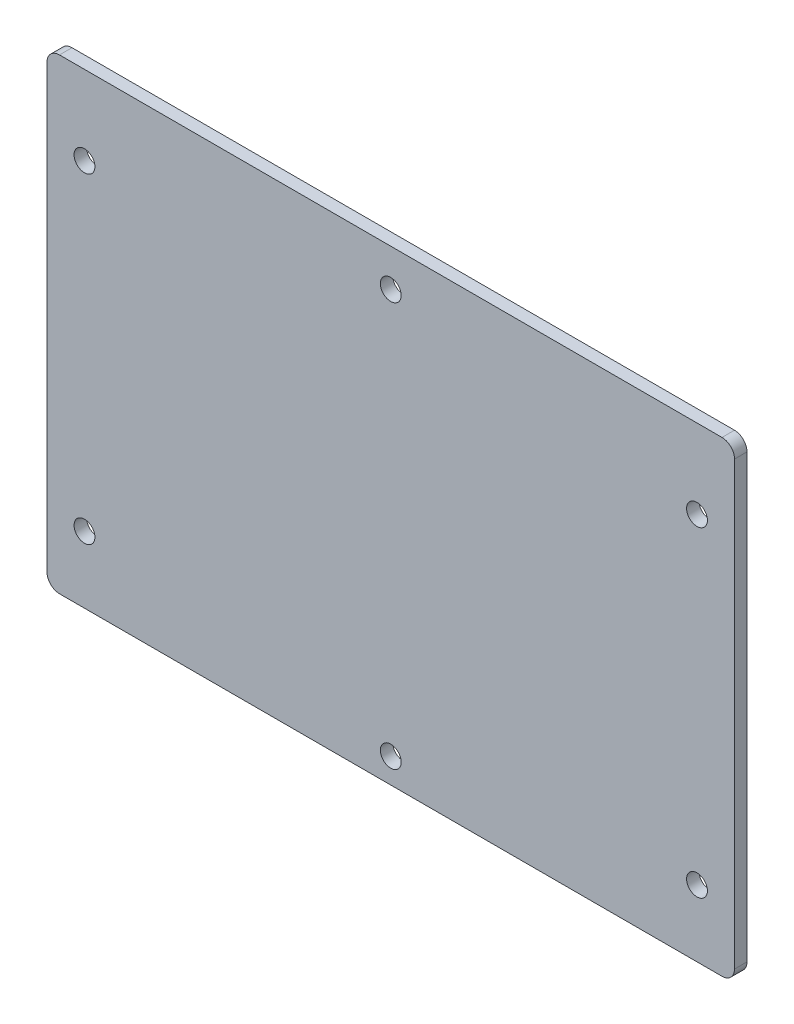
ISO-10303-21;
HEADER;
FILE_DESCRIPTION(('STEP AP214'),'2;1');
FILE_NAME('part.step','',(''),(''),'','','');
FILE_SCHEMA(('AUTOMOTIVE_DESIGN { 1 0 10303 214 1 1 1 1 }'));
ENDSEC;
DATA;
#1=APPLICATION_CONTEXT('core data for automotive mechanical design processes');
#2=APPLICATION_PROTOCOL_DEFINITION('international standard','automotive_design',2000,#1);
#3=PRODUCT_CONTEXT('',#1,'mechanical');
#4=PRODUCT('Part','Part','',(#3));
#5=PRODUCT_RELATED_PRODUCT_CATEGORY('part','',(#4));
#6=PRODUCT_DEFINITION_FORMATION('','',#4);
#7=PRODUCT_DEFINITION_CONTEXT('part definition',#1,'design');
#8=PRODUCT_DEFINITION('design','',#6,#7);
#9=PRODUCT_DEFINITION_SHAPE('','',#8);
#10=(LENGTH_UNIT() NAMED_UNIT(*) SI_UNIT(.MILLI.,.METRE.));
#11=(NAMED_UNIT(*) PLANE_ANGLE_UNIT() SI_UNIT($,.RADIAN.));
#12=(NAMED_UNIT(*) SI_UNIT($,.STERADIAN.) SOLID_ANGLE_UNIT());
#13=UNCERTAINTY_MEASURE_WITH_UNIT(LENGTH_MEASURE(1.E-05),#10,'distance_accuracy_value','');
#14=(GEOMETRIC_REPRESENTATION_CONTEXT(3) GLOBAL_UNCERTAINTY_ASSIGNED_CONTEXT((#13)) GLOBAL_UNIT_ASSIGNED_CONTEXT((#10,
#11,#12)) REPRESENTATION_CONTEXT('',''));
#15=CARTESIAN_POINT('',(0.,0.,0.));
#16=DIRECTION('',(0.,0.,1.));
#17=DIRECTION('',(1.,0.,0.));
#18=AXIS2_PLACEMENT_3D('',#15,#16,#17);
#19=CARTESIAN_POINT('',(0.,0.,3.));
#20=DIRECTION('',(0.,0.,-1.));
#21=DIRECTION('',(-1.,0.,0.));
#22=AXIS2_PLACEMENT_3D('',#19,#20,#21);
#23=PLANE('',#22);
#24=DIRECTION('',(0.,-1.,0.));
#25=VECTOR('',#24,1.);
#26=CARTESIAN_POINT('',(0.,0.,3.));
#27=LINE('',#26,#25);
#28=CARTESIAN_POINT('',(0.,115.00212,3.));
#29=VERTEX_POINT('',#28);
#30=CARTESIAN_POINT('',(0.,8.99999999999999,3.));
#31=VERTEX_POINT('',#30);
#32=EDGE_CURVE('E125',#29,#31,#27,.T.);
#33=ORIENTED_EDGE('',*,*,#32,.T.);
#34=CARTESIAN_POINT('',(3.,8.99999999999999,3.));
#35=DIRECTION('',(0.,0.,-1.));
#36=DIRECTION('',(-1.,0.,0.));
#37=AXIS2_PLACEMENT_3D('',#34,#35,#36);
#38=CIRCLE('',#37,3.);
#39=CARTESIAN_POINT('',(3.,5.99999999999999,3.));
#40=VERTEX_POINT('',#39);
#41=EDGE_CURVE('E41',#31,#40,#38,.F.);
#42=ORIENTED_EDGE('',*,*,#41,.T.);
#43=DIRECTION('',(1.,0.,0.));
#44=VECTOR('',#43,1.);
#45=CARTESIAN_POINT('',(0.,5.99999999999999,3.));
#46=LINE('',#45,#44);
#47=CARTESIAN_POINT('',(162.,5.99999999999999,3.));
#48=VERTEX_POINT('',#47);
#49=EDGE_CURVE('E157',#40,#48,#46,.T.);
#50=ORIENTED_EDGE('',*,*,#49,.T.);
#51=CARTESIAN_POINT('',(162.,8.99999999999999,3.));
#52=DIRECTION('',(0.,0.,-1.));
#53=DIRECTION('',(-1.,0.,0.));
#54=AXIS2_PLACEMENT_3D('',#51,#52,#53);
#55=CIRCLE('',#54,3.);
#56=CARTESIAN_POINT('',(165.,8.99999999999999,3.));
#57=VERTEX_POINT('',#56);
#58=EDGE_CURVE('E48',#48,#57,#55,.F.);
#59=ORIENTED_EDGE('',*,*,#58,.T.);
#60=DIRECTION('',(0.,1.,0.));
#61=VECTOR('',#60,1.);
#62=CARTESIAN_POINT('',(165.,118.00212,3.));
#63=LINE('',#62,#61);
#64=CARTESIAN_POINT('',(165.,115.00212,3.));
#65=VERTEX_POINT('',#64);
#66=EDGE_CURVE('E171',#57,#65,#63,.T.);
#67=ORIENTED_EDGE('',*,*,#66,.T.);
#68=CARTESIAN_POINT('',(162.,115.00212,3.));
#69=DIRECTION('',(0.,0.,-1.));
#70=DIRECTION('',(-1.,0.,0.));
#71=AXIS2_PLACEMENT_3D('',#68,#69,#70);
#72=CIRCLE('',#71,3.);
#73=CARTESIAN_POINT('',(162.,118.00212,3.));
#74=VERTEX_POINT('',#73);
#75=EDGE_CURVE('E124',#65,#74,#72,.F.);
#76=ORIENTED_EDGE('',*,*,#75,.T.);
#77=DIRECTION('',(-1.,0.,0.));
#78=VECTOR('',#77,1.);
#79=CARTESIAN_POINT('',(0.,118.00212,3.));
#80=LINE('',#79,#78);
#81=CARTESIAN_POINT('',(3.,118.00212,3.));
#82=VERTEX_POINT('',#81);
#83=EDGE_CURVE('E127',#74,#82,#80,.T.);
#84=ORIENTED_EDGE('',*,*,#83,.T.);
#85=CARTESIAN_POINT('',(3.,115.00212,3.));
#86=DIRECTION('',(0.,0.,-1.));
#87=DIRECTION('',(-1.,0.,0.));
#88=AXIS2_PLACEMENT_3D('',#85,#86,#87);
#89=CIRCLE('',#88,3.);
#90=EDGE_CURVE('E135',#82,#29,#89,.F.);
#91=ORIENTED_EDGE('',*,*,#90,.T.);
#92=EDGE_LOOP('',(#33,#42,#50,#59,#67,#76,#84,#91));
#93=FACE_BOUND('',#92,.T.);
#94=CARTESIAN_POINT('',(82.5,109.00212,3.));
#95=DIRECTION('',(0.,0.,1.));
#96=DIRECTION('',(1.,0.,0.));
#97=AXIS2_PLACEMENT_3D('',#94,#95,#96);
#98=CIRCLE('',#97,2.50000000000001);
#99=CARTESIAN_POINT('',(85.,109.00212,3.));
#100=VERTEX_POINT('',#99);
#101=EDGE_CURVE('E110',#100,#100,#98,.T.);
#102=ORIENTED_EDGE('',*,*,#101,.F.);
#103=EDGE_LOOP('',(#102));
#104=FACE_BOUND('',#103,.T.);
#105=CARTESIAN_POINT('',(9.00000000000001,99.00212,3.));
#106=DIRECTION('',(0.,0.,1.));
#107=DIRECTION('',(1.,0.,0.));
#108=AXIS2_PLACEMENT_3D('',#105,#106,#107);
#109=CIRCLE('',#108,2.50000000000002);
#110=CARTESIAN_POINT('',(11.5,99.00212,3.));
#111=VERTEX_POINT('',#110);
#112=EDGE_CURVE('E181',#111,#111,#109,.T.);
#113=ORIENTED_EDGE('',*,*,#112,.F.);
#114=EDGE_LOOP('',(#113));
#115=FACE_BOUND('',#114,.T.);
#116=CARTESIAN_POINT('',(9.00000000000001,22.,3.));
#117=DIRECTION('',(0.,0.,1.));
#118=DIRECTION('',(-1.,0.,0.));
#119=AXIS2_PLACEMENT_3D('',#116,#117,#118);
#120=CIRCLE('',#119,2.50000000000002);
#121=CARTESIAN_POINT('',(6.49999999999999,22.,3.));
#122=VERTEX_POINT('',#121);
#123=EDGE_CURVE('E187',#122,#122,#120,.T.);
#124=ORIENTED_EDGE('',*,*,#123,.F.);
#125=EDGE_LOOP('',(#124));
#126=FACE_BOUND('',#125,.T.);
#127=CARTESIAN_POINT('',(82.5,12.,3.));
#128=DIRECTION('',(0.,0.,1.));
#129=DIRECTION('',(-1.,0.,0.));
#130=AXIS2_PLACEMENT_3D('',#127,#128,#129);
#131=CIRCLE('',#130,2.50000000000001);
#132=CARTESIAN_POINT('',(80.,12.,3.));
#133=VERTEX_POINT('',#132);
#134=EDGE_CURVE('E193',#133,#133,#131,.T.);
#135=ORIENTED_EDGE('',*,*,#134,.F.);
#136=EDGE_LOOP('',(#135));
#137=FACE_BOUND('',#136,.T.);
#138=CARTESIAN_POINT('',(156.,99.00212,3.));
#139=DIRECTION('',(0.,0.,1.));
#140=DIRECTION('',(-1.,0.,0.));
#141=AXIS2_PLACEMENT_3D('',#138,#139,#140);
#142=CIRCLE('',#141,2.50000000000002);
#143=CARTESIAN_POINT('',(153.5,99.00212,3.));
#144=VERTEX_POINT('',#143);
#145=EDGE_CURVE('E199',#144,#144,#142,.T.);
#146=ORIENTED_EDGE('',*,*,#145,.F.);
#147=EDGE_LOOP('',(#146));
#148=FACE_BOUND('',#147,.T.);
#149=CARTESIAN_POINT('',(156.,22.,3.));
#150=DIRECTION('',(0.,0.,1.));
#151=DIRECTION('',(1.,0.,0.));
#152=AXIS2_PLACEMENT_3D('',#149,#150,#151);
#153=CIRCLE('',#152,2.50000000000002);
#154=CARTESIAN_POINT('',(158.5,22.,3.));
#155=VERTEX_POINT('',#154);
#156=EDGE_CURVE('E205',#155,#155,#153,.T.);
#157=ORIENTED_EDGE('',*,*,#156,.F.);
#158=EDGE_LOOP('',(#157));
#159=FACE_BOUND('',#158,.T.);
#160=ADVANCED_FACE('F33',(#93,#104,#115,#126,#137,#148,#159),#23,.F.);
#161=CARTESIAN_POINT('',(0.,0.,0.));
#162=DIRECTION('',(0.,0.,-1.));
#163=DIRECTION('',(-1.,0.,0.));
#164=AXIS2_PLACEMENT_3D('',#161,#162,#163);
#165=PLANE('',#164);
#166=DIRECTION('',(1.,0.,0.));
#167=VECTOR('',#166,1.);
#168=CARTESIAN_POINT('',(0.,5.99999999999999,0.));
#169=LINE('',#168,#167);
#170=CARTESIAN_POINT('',(3.,5.99999999999999,0.));
#171=VERTEX_POINT('',#170);
#172=CARTESIAN_POINT('',(162.,5.99999999999999,0.));
#173=VERTEX_POINT('',#172);
#174=EDGE_CURVE('E165',#171,#173,#169,.T.);
#175=ORIENTED_EDGE('',*,*,#174,.F.);
#176=CARTESIAN_POINT('',(3.,8.99999999999999,0.));
#177=DIRECTION('',(0.,0.,-1.));
#178=DIRECTION('',(-1.,0.,0.));
#179=AXIS2_PLACEMENT_3D('',#176,#177,#178);
#180=CIRCLE('',#179,3.);
#181=CARTESIAN_POINT('',(0.,8.99999999999999,0.));
#182=VERTEX_POINT('',#181);
#183=EDGE_CURVE('E151',#171,#182,#180,.T.);
#184=ORIENTED_EDGE('',*,*,#183,.T.);
#185=DIRECTION('',(0.,-1.,0.));
#186=VECTOR('',#185,1.);
#187=CARTESIAN_POINT('',(0.,0.,0.));
#188=LINE('',#187,#186);
#189=CARTESIAN_POINT('',(0.,115.00212,0.));
#190=VERTEX_POINT('',#189);
#191=EDGE_CURVE('E130',#190,#182,#188,.T.);
#192=ORIENTED_EDGE('',*,*,#191,.F.);
#193=CARTESIAN_POINT('',(3.,115.00212,0.));
#194=DIRECTION('',(0.,0.,-1.));
#195=DIRECTION('',(-1.,0.,0.));
#196=AXIS2_PLACEMENT_3D('',#193,#194,#195);
#197=CIRCLE('',#196,3.);
#198=CARTESIAN_POINT('',(3.,118.00212,0.));
#199=VERTEX_POINT('',#198);
#200=EDGE_CURVE('E121',#190,#199,#197,.T.);
#201=ORIENTED_EDGE('',*,*,#200,.T.);
#202=DIRECTION('',(-1.,0.,0.));
#203=VECTOR('',#202,1.);
#204=CARTESIAN_POINT('',(0.,118.00212,0.));
#205=LINE('',#204,#203);
#206=CARTESIAN_POINT('',(162.,118.00212,0.));
#207=VERTEX_POINT('',#206);
#208=EDGE_CURVE('E109',#207,#199,#205,.T.);
#209=ORIENTED_EDGE('',*,*,#208,.F.);
#210=CARTESIAN_POINT('',(162.,115.00212,0.));
#211=DIRECTION('',(0.,0.,-1.));
#212=DIRECTION('',(-1.,0.,0.));
#213=AXIS2_PLACEMENT_3D('',#210,#211,#212);
#214=CIRCLE('',#213,3.);
#215=CARTESIAN_POINT('',(165.,115.00212,0.));
#216=VERTEX_POINT('',#215);
#217=EDGE_CURVE('E113',#207,#216,#214,.T.);
#218=ORIENTED_EDGE('',*,*,#217,.T.);
#219=DIRECTION('',(0.,1.,0.));
#220=VECTOR('',#219,1.);
#221=CARTESIAN_POINT('',(165.,118.00212,0.));
#222=LINE('',#221,#220);
#223=CARTESIAN_POINT('',(165.,8.99999999999999,0.));
#224=VERTEX_POINT('',#223);
#225=EDGE_CURVE('E101',#224,#216,#222,.T.);
#226=ORIENTED_EDGE('',*,*,#225,.F.);
#227=CARTESIAN_POINT('',(162.,8.99999999999999,0.));
#228=DIRECTION('',(0.,0.,-1.));
#229=DIRECTION('',(-1.,0.,0.));
#230=AXIS2_PLACEMENT_3D('',#227,#228,#229);
#231=CIRCLE('',#230,3.);
#232=EDGE_CURVE('E149',#224,#173,#231,.T.);
#233=ORIENTED_EDGE('',*,*,#232,.T.);
#234=EDGE_LOOP('',(#175,#184,#192,#201,#209,#218,#226,#233));
#235=FACE_BOUND('',#234,.T.);
#236=CARTESIAN_POINT('',(156.,99.00212,0.));
#237=DIRECTION('',(0.,0.,1.));
#238=DIRECTION('',(-1.,0.,0.));
#239=AXIS2_PLACEMENT_3D('',#236,#237,#238);
#240=CIRCLE('',#239,2.50000000000002);
#241=CARTESIAN_POINT('',(153.5,99.00212,0.));
#242=VERTEX_POINT('',#241);
#243=EDGE_CURVE('E202',#242,#242,#240,.T.);
#244=ORIENTED_EDGE('',*,*,#243,.T.);
#245=EDGE_LOOP('',(#244));
#246=FACE_BOUND('',#245,.T.);
#247=CARTESIAN_POINT('',(9.00000000000001,22.,0.));
#248=DIRECTION('',(0.,0.,1.));
#249=DIRECTION('',(-1.,0.,0.));
#250=AXIS2_PLACEMENT_3D('',#247,#248,#249);
#251=CIRCLE('',#250,2.50000000000002);
#252=CARTESIAN_POINT('',(6.49999999999999,22.,0.));
#253=VERTEX_POINT('',#252);
#254=EDGE_CURVE('E190',#253,#253,#251,.T.);
#255=ORIENTED_EDGE('',*,*,#254,.T.);
#256=EDGE_LOOP('',(#255));
#257=FACE_BOUND('',#256,.T.);
#258=CARTESIAN_POINT('',(82.5,109.00212,0.));
#259=DIRECTION('',(0.,0.,1.));
#260=DIRECTION('',(1.,0.,0.));
#261=AXIS2_PLACEMENT_3D('',#258,#259,#260);
#262=CIRCLE('',#261,2.50000000000001);
#263=CARTESIAN_POINT('',(85.,109.00212,0.));
#264=VERTEX_POINT('',#263);
#265=EDGE_CURVE('E178',#264,#264,#262,.T.);
#266=ORIENTED_EDGE('',*,*,#265,.T.);
#267=EDGE_LOOP('',(#266));
#268=FACE_BOUND('',#267,.T.);
#269=CARTESIAN_POINT('',(9.00000000000001,99.00212,0.));
#270=DIRECTION('',(0.,0.,1.));
#271=DIRECTION('',(1.,0.,0.));
#272=AXIS2_PLACEMENT_3D('',#269,#270,#271);
#273=CIRCLE('',#272,2.50000000000002);
#274=CARTESIAN_POINT('',(11.5,99.00212,0.));
#275=VERTEX_POINT('',#274);
#276=EDGE_CURVE('E184',#275,#275,#273,.T.);
#277=ORIENTED_EDGE('',*,*,#276,.T.);
#278=EDGE_LOOP('',(#277));
#279=FACE_BOUND('',#278,.T.);
#280=CARTESIAN_POINT('',(82.5,12.,0.));
#281=DIRECTION('',(0.,0.,1.));
#282=DIRECTION('',(-1.,0.,0.));
#283=AXIS2_PLACEMENT_3D('',#280,#281,#282);
#284=CIRCLE('',#283,2.50000000000001);
#285=CARTESIAN_POINT('',(80.,12.,0.));
#286=VERTEX_POINT('',#285);
#287=EDGE_CURVE('E196',#286,#286,#284,.T.);
#288=ORIENTED_EDGE('',*,*,#287,.T.);
#289=EDGE_LOOP('',(#288));
#290=FACE_BOUND('',#289,.T.);
#291=CARTESIAN_POINT('',(156.,22.,0.));
#292=DIRECTION('',(0.,0.,1.));
#293=DIRECTION('',(1.,0.,0.));
#294=AXIS2_PLACEMENT_3D('',#291,#292,#293);
#295=CIRCLE('',#294,2.50000000000002);
#296=CARTESIAN_POINT('',(158.5,22.,0.));
#297=VERTEX_POINT('',#296);
#298=EDGE_CURVE('E164',#297,#297,#295,.T.);
#299=ORIENTED_EDGE('',*,*,#298,.T.);
#300=EDGE_LOOP('',(#299));
#301=FACE_BOUND('',#300,.T.);
#302=ADVANCED_FACE('F115',(#235,#246,#257,#268,#279,#290,#301),#165,.T.);
#303=CARTESIAN_POINT('',(165.,118.00212,3.));
#304=DIRECTION('',(-1.,0.,0.));
#305=DIRECTION('',(0.,0.,1.));
#306=AXIS2_PLACEMENT_3D('',#303,#304,#305);
#307=PLANE('',#306);
#308=ORIENTED_EDGE('',*,*,#66,.F.);
#309=DIRECTION('',(0.,0.,-1.));
#310=VECTOR('',#309,1.);
#311=CARTESIAN_POINT('',(165.,8.99999999999999,3.));
#312=LINE('',#311,#310);
#313=EDGE_CURVE('E11',#57,#224,#312,.T.);
#314=ORIENTED_EDGE('',*,*,#313,.T.);
#315=ORIENTED_EDGE('',*,*,#225,.T.);
#316=DIRECTION('',(0.,0.,-1.));
#317=VECTOR('',#316,1.);
#318=CARTESIAN_POINT('',(165.,115.00212,3.));
#319=LINE('',#318,#317);
#320=EDGE_CURVE('E105',#216,#65,#319,.F.);
#321=ORIENTED_EDGE('',*,*,#320,.T.);
#322=EDGE_LOOP('',(#308,#314,#315,#321));
#323=FACE_BOUND('',#322,.T.);
#324=ADVANCED_FACE('F103',(#323),#307,.F.);
#325=CARTESIAN_POINT('',(0.,118.00212,3.));
#326=DIRECTION('',(0.,-1.,0.));
#327=DIRECTION('',(0.,0.,-1.));
#328=AXIS2_PLACEMENT_3D('',#325,#326,#327);
#329=PLANE('',#328);
#330=ORIENTED_EDGE('',*,*,#208,.T.);
#331=DIRECTION('',(0.,0.,-1.));
#332=VECTOR('',#331,1.);
#333=CARTESIAN_POINT('',(3.,118.00212,3.));
#334=LINE('',#333,#332);
#335=EDGE_CURVE('E142',#199,#82,#334,.F.);
#336=ORIENTED_EDGE('',*,*,#335,.T.);
#337=ORIENTED_EDGE('',*,*,#83,.F.);
#338=DIRECTION('',(0.,0.,-1.));
#339=VECTOR('',#338,1.);
#340=CARTESIAN_POINT('',(162.,118.00212,3.));
#341=LINE('',#340,#339);
#342=EDGE_CURVE('E140',#74,#207,#341,.T.);
#343=ORIENTED_EDGE('',*,*,#342,.T.);
#344=EDGE_LOOP('',(#330,#336,#337,#343));
#345=FACE_BOUND('',#344,.T.);
#346=ADVANCED_FACE('F230',(#345),#329,.F.);
#347=CARTESIAN_POINT('',(0.,0.,3.));
#348=DIRECTION('',(1.,0.,0.));
#349=DIRECTION('',(0.,0.,-1.));
#350=AXIS2_PLACEMENT_3D('',#347,#348,#349);
#351=PLANE('',#350);
#352=ORIENTED_EDGE('',*,*,#191,.T.);
#353=DIRECTION('',(0.,0.,-1.));
#354=VECTOR('',#353,1.);
#355=CARTESIAN_POINT('',(0.,8.99999999999999,3.));
#356=LINE('',#355,#354);
#357=EDGE_CURVE('E56',#182,#31,#356,.F.);
#358=ORIENTED_EDGE('',*,*,#357,.T.);
#359=ORIENTED_EDGE('',*,*,#32,.F.);
#360=DIRECTION('',(0.,0.,-1.));
#361=VECTOR('',#360,1.);
#362=CARTESIAN_POINT('',(0.,115.00212,3.));
#363=LINE('',#362,#361);
#364=EDGE_CURVE('E137',#29,#190,#363,.T.);
#365=ORIENTED_EDGE('',*,*,#364,.T.);
#366=EDGE_LOOP('',(#352,#358,#359,#365));
#367=FACE_BOUND('',#366,.T.);
#368=ADVANCED_FACE('F169',(#367),#351,.F.);
#369=CARTESIAN_POINT('',(82.5,109.00212,3.));
#370=DIRECTION('',(0.,0.,-1.));
#371=DIRECTION('',(-1.,0.,0.));
#372=AXIS2_PLACEMENT_3D('',#369,#370,#371);
#373=CYLINDRICAL_SURFACE('',#372,2.50000000000001);
#374=ORIENTED_EDGE('',*,*,#101,.T.);
#375=EDGE_LOOP('',(#374));
#376=FACE_BOUND('',#375,.T.);
#377=ORIENTED_EDGE('',*,*,#265,.F.);
#378=EDGE_LOOP('',(#377));
#379=FACE_BOUND('',#378,.T.);
#380=ADVANCED_FACE('F225',(#376,#379),#373,.F.);
#381=CARTESIAN_POINT('',(9.00000000000001,99.00212,3.));
#382=DIRECTION('',(0.,0.,-1.));
#383=DIRECTION('',(-1.,0.,0.));
#384=AXIS2_PLACEMENT_3D('',#381,#382,#383);
#385=CYLINDRICAL_SURFACE('',#384,2.50000000000002);
#386=ORIENTED_EDGE('',*,*,#112,.T.);
#387=EDGE_LOOP('',(#386));
#388=FACE_BOUND('',#387,.T.);
#389=ORIENTED_EDGE('',*,*,#276,.F.);
#390=EDGE_LOOP('',(#389));
#391=FACE_BOUND('',#390,.T.);
#392=ADVANCED_FACE('F260',(#388,#391),#385,.F.);
#393=CARTESIAN_POINT('',(9.00000000000001,22.,3.));
#394=DIRECTION('',(0.,0.,-1.));
#395=DIRECTION('',(-1.,0.,0.));
#396=AXIS2_PLACEMENT_3D('',#393,#394,#395);
#397=CYLINDRICAL_SURFACE('',#396,2.50000000000002);
#398=ORIENTED_EDGE('',*,*,#123,.T.);
#399=EDGE_LOOP('',(#398));
#400=FACE_BOUND('',#399,.T.);
#401=ORIENTED_EDGE('',*,*,#254,.F.);
#402=EDGE_LOOP('',(#401));
#403=FACE_BOUND('',#402,.T.);
#404=ADVANCED_FACE('F257',(#400,#403),#397,.F.);
#405=CARTESIAN_POINT('',(82.5,12.,3.));
#406=DIRECTION('',(0.,0.,-1.));
#407=DIRECTION('',(-1.,0.,0.));
#408=AXIS2_PLACEMENT_3D('',#405,#406,#407);
#409=CYLINDRICAL_SURFACE('',#408,2.50000000000001);
#410=ORIENTED_EDGE('',*,*,#134,.T.);
#411=EDGE_LOOP('',(#410));
#412=FACE_BOUND('',#411,.T.);
#413=ORIENTED_EDGE('',*,*,#287,.F.);
#414=EDGE_LOOP('',(#413));
#415=FACE_BOUND('',#414,.T.);
#416=ADVANCED_FACE('F253',(#412,#415),#409,.F.);
#417=CARTESIAN_POINT('',(156.,99.00212,3.));
#418=DIRECTION('',(0.,0.,-1.));
#419=DIRECTION('',(-1.,0.,0.));
#420=AXIS2_PLACEMENT_3D('',#417,#418,#419);
#421=CYLINDRICAL_SURFACE('',#420,2.50000000000002);
#422=ORIENTED_EDGE('',*,*,#145,.T.);
#423=EDGE_LOOP('',(#422));
#424=FACE_BOUND('',#423,.T.);
#425=ORIENTED_EDGE('',*,*,#243,.F.);
#426=EDGE_LOOP('',(#425));
#427=FACE_BOUND('',#426,.T.);
#428=ADVANCED_FACE('F249',(#424,#427),#421,.F.);
#429=CARTESIAN_POINT('',(156.,22.,3.));
#430=DIRECTION('',(0.,0.,-1.));
#431=DIRECTION('',(-1.,0.,0.));
#432=AXIS2_PLACEMENT_3D('',#429,#430,#431);
#433=CYLINDRICAL_SURFACE('',#432,2.50000000000002);
#434=ORIENTED_EDGE('',*,*,#156,.T.);
#435=EDGE_LOOP('',(#434));
#436=FACE_BOUND('',#435,.T.);
#437=ORIENTED_EDGE('',*,*,#298,.F.);
#438=EDGE_LOOP('',(#437));
#439=FACE_BOUND('',#438,.T.);
#440=ADVANCED_FACE('F238',(#436,#439),#433,.F.);
#441=CARTESIAN_POINT('',(3.,115.00212,3.));
#442=DIRECTION('',(0.,0.,-1.));
#443=DIRECTION('',(-1.,0.,0.));
#444=AXIS2_PLACEMENT_3D('',#441,#442,#443);
#445=CYLINDRICAL_SURFACE('',#444,3.);
#446=ORIENTED_EDGE('',*,*,#90,.F.);
#447=ORIENTED_EDGE('',*,*,#335,.F.);
#448=ORIENTED_EDGE('',*,*,#200,.F.);
#449=ORIENTED_EDGE('',*,*,#364,.F.);
#450=EDGE_LOOP('',(#446,#447,#448,#449));
#451=FACE_BOUND('',#450,.T.);
#452=ADVANCED_FACE('F235',(#451),#445,.T.);
#453=CARTESIAN_POINT('',(162.,115.00212,3.));
#454=DIRECTION('',(0.,0.,-1.));
#455=DIRECTION('',(-1.,0.,0.));
#456=AXIS2_PLACEMENT_3D('',#453,#454,#455);
#457=CYLINDRICAL_SURFACE('',#456,3.);
#458=ORIENTED_EDGE('',*,*,#75,.F.);
#459=ORIENTED_EDGE('',*,*,#320,.F.);
#460=ORIENTED_EDGE('',*,*,#217,.F.);
#461=ORIENTED_EDGE('',*,*,#342,.F.);
#462=EDGE_LOOP('',(#458,#459,#460,#461));
#463=FACE_BOUND('',#462,.T.);
#464=ADVANCED_FACE('F123',(#463),#457,.T.);
#465=CARTESIAN_POINT('',(0.,5.99999999999999,10.));
#466=DIRECTION('',(0.,1.,0.));
#467=DIRECTION('',(-1.,0.,0.));
#468=AXIS2_PLACEMENT_3D('',#465,#466,#467);
#469=PLANE('',#468);
#470=ORIENTED_EDGE('',*,*,#49,.F.);
#471=DIRECTION('',(0.,0.,-1.));
#472=VECTOR('',#471,1.);
#473=CARTESIAN_POINT('',(3.,5.99999999999999,10.));
#474=LINE('',#473,#472);
#475=EDGE_CURVE('E146',#40,#171,#474,.T.);
#476=ORIENTED_EDGE('',*,*,#475,.T.);
#477=ORIENTED_EDGE('',*,*,#174,.T.);
#478=DIRECTION('',(0.,0.,-1.));
#479=VECTOR('',#478,1.);
#480=CARTESIAN_POINT('',(162.,5.99999999999999,10.));
#481=LINE('',#480,#479);
#482=EDGE_CURVE('E144',#173,#48,#481,.F.);
#483=ORIENTED_EDGE('',*,*,#482,.T.);
#484=EDGE_LOOP('',(#470,#476,#477,#483));
#485=FACE_BOUND('',#484,.T.);
#486=ADVANCED_FACE('F161',(#485),#469,.F.);
#487=CARTESIAN_POINT('',(3.,8.99999999999999,10.));
#488=DIRECTION('',(0.,0.,-1.));
#489=DIRECTION('',(-1.,0.,0.));
#490=AXIS2_PLACEMENT_3D('',#487,#488,#489);
#491=CYLINDRICAL_SURFACE('',#490,3.);
#492=ORIENTED_EDGE('',*,*,#41,.F.);
#493=ORIENTED_EDGE('',*,*,#357,.F.);
#494=ORIENTED_EDGE('',*,*,#183,.F.);
#495=ORIENTED_EDGE('',*,*,#475,.F.);
#496=EDGE_LOOP('',(#492,#493,#494,#495));
#497=FACE_BOUND('',#496,.T.);
#498=ADVANCED_FACE('F167',(#497),#491,.T.);
#499=CARTESIAN_POINT('',(162.,8.99999999999999,3.));
#500=DIRECTION('',(0.,0.,-1.));
#501=DIRECTION('',(-1.,0.,0.));
#502=AXIS2_PLACEMENT_3D('',#499,#500,#501);
#503=CYLINDRICAL_SURFACE('',#502,3.);
#504=ORIENTED_EDGE('',*,*,#58,.F.);
#505=ORIENTED_EDGE('',*,*,#482,.F.);
#506=ORIENTED_EDGE('',*,*,#232,.F.);
#507=ORIENTED_EDGE('',*,*,#313,.F.);
#508=EDGE_LOOP('',(#504,#505,#506,#507));
#509=FACE_BOUND('',#508,.T.);
#510=ADVANCED_FACE('F35',(#509),#503,.T.);
#511=CLOSED_SHELL('',(#160,#302,#324,#346,#368,#380,#392,#404,#416,#428,#440,#452,#464,#486,
#498,#510));
#512=MANIFOLD_SOLID_BREP('B2',#511);
#513=ADVANCED_BREP_SHAPE_REPRESENTATION('',(#18,#512),#14);
#514=SHAPE_DEFINITION_REPRESENTATION(#9,#513);
ENDSEC;
END-ISO-10303-21;
